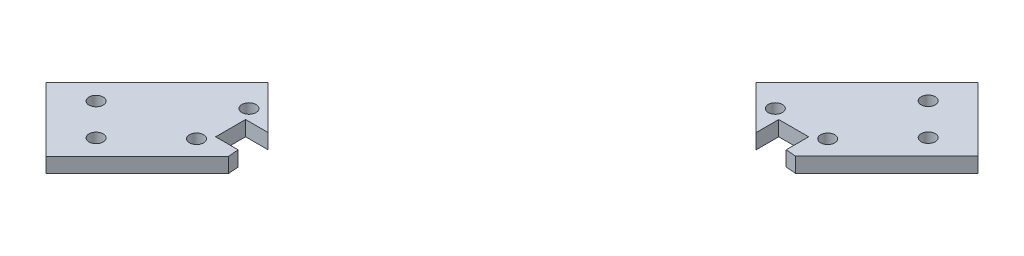
ISO-10303-21;
HEADER;
FILE_DESCRIPTION(('STEP AP214'),'2;1');
FILE_NAME('part.step','',(''),(''),'','','');
FILE_SCHEMA(('AUTOMOTIVE_DESIGN { 1 0 10303 214 1 1 1 1 }'));
ENDSEC;
DATA;
#1=APPLICATION_CONTEXT('core data for automotive mechanical design processes');
#2=APPLICATION_PROTOCOL_DEFINITION('international standard','automotive_design',2000,#1);
#3=PRODUCT_CONTEXT('',#1,'mechanical');
#4=PRODUCT('Part','Part','',(#3));
#5=PRODUCT_RELATED_PRODUCT_CATEGORY('part','',(#4));
#6=PRODUCT_DEFINITION_FORMATION('','',#4);
#7=PRODUCT_DEFINITION_CONTEXT('part definition',#1,'design');
#8=PRODUCT_DEFINITION('design','',#6,#7);
#9=PRODUCT_DEFINITION_SHAPE('','',#8);
#10=(LENGTH_UNIT() NAMED_UNIT(*) SI_UNIT(.MILLI.,.METRE.));
#11=(NAMED_UNIT(*) PLANE_ANGLE_UNIT() SI_UNIT($,.RADIAN.));
#12=(NAMED_UNIT(*) SI_UNIT($,.STERADIAN.) SOLID_ANGLE_UNIT());
#13=UNCERTAINTY_MEASURE_WITH_UNIT(LENGTH_MEASURE(1.E-05),#10,'distance_accuracy_value','');
#14=(GEOMETRIC_REPRESENTATION_CONTEXT(3) GLOBAL_UNCERTAINTY_ASSIGNED_CONTEXT((#13)) GLOBAL_UNIT_ASSIGNED_CONTEXT((#10,
#11,#12)) REPRESENTATION_CONTEXT('',''));
#15=CARTESIAN_POINT('',(0.,0.,0.));
#16=DIRECTION('',(0.,0.,1.));
#17=DIRECTION('',(1.,0.,0.));
#18=AXIS2_PLACEMENT_3D('',#15,#16,#17);
#19=CARTESIAN_POINT('',(0.,3.175,0.));
#20=DIRECTION('',(0.,1.,0.));
#21=DIRECTION('',(0.,0.,1.));
#22=AXIS2_PLACEMENT_3D('',#19,#20,#21);
#23=PLANE('',#22);
#24=CARTESIAN_POINT('',(-72.1592637490422,3.175,16.043664022809));
#25=DIRECTION('',(0.,1.,0.));
#26=DIRECTION('',(0.,0.,1.));
#27=AXIS2_PLACEMENT_3D('',#24,#25,#26);
#28=CIRCLE('',#27,1.5);
#29=CARTESIAN_POINT('',(-72.1592637490422,3.175,17.543664022809));
#30=VERTEX_POINT('',#29);
#31=EDGE_CURVE('E195',#30,#30,#28,.T.);
#32=ORIENTED_EDGE('',*,*,#31,.F.);
#33=EDGE_LOOP('',(#32));
#34=FACE_BOUND('',#33,.T.);
#35=CARTESIAN_POINT('',(-78.9286379907904,3.175,9.2807290260109));
#36=DIRECTION('',(0.,1.,0.));
#37=DIRECTION('',(0.,0.,1.));
#38=AXIS2_PLACEMENT_3D('',#35,#36,#37);
#39=CIRCLE('',#38,1.5);
#40=CARTESIAN_POINT('',(-78.9286379907904,3.175,10.7807290260109));
#41=VERTEX_POINT('',#40);
#42=EDGE_CURVE('E231',#41,#41,#39,.T.);
#43=ORIENTED_EDGE('',*,*,#42,.F.);
#44=EDGE_LOOP('',(#43));
#45=FACE_BOUND('',#44,.T.);
#46=DIRECTION('',(0.706770229864482,0.,-0.707443172401365));
#47=VECTOR('',#46,1.);
#48=CARTESIAN_POINT('',(11.12169927642,3.175,-87.6247258638486));
#49=LINE('',#48,#47);
#50=CARTESIAN_POINT('',(-87.6141018356481,3.175,11.2050853206221));
#51=VERTEX_POINT('',#50);
#52=CARTESIAN_POINT('',(-64.0867150619098,3.175,-12.3447027635743));
#53=VERTEX_POINT('',#52);
#54=EDGE_CURVE('E61',#51,#53,#49,.T.);
#55=ORIENTED_EDGE('',*,*,#54,.F.);
#56=DIRECTION('',(-0.707443172401365,0.,-0.706770229864482));
#57=VECTOR('',#56,1.);
#58=CARTESIAN_POINT('',(-49.3679005560341,3.175,49.4149055922353));
#59=LINE('',#58,#57);
#60=CARTESIAN_POINT('',(-74.0753533521517,3.175,24.7309553142183));
#61=VERTEX_POINT('',#60);
#62=EDGE_CURVE('E122',#61,#51,#59,.T.);
#63=ORIENTED_EDGE('',*,*,#62,.F.);
#64=DIRECTION('',(-0.706770229864482,0.,0.707443172401365));
#65=VECTOR('',#64,1.);
#66=CARTESIAN_POINT('',(-24.7074527961177,3.175,-24.683950278017));
#67=LINE('',#66,#65);
#68=CARTESIAN_POINT('',(-54.7368246857531,3.175,5.3740137068235));
#69=VERTEX_POINT('',#68);
#70=EDGE_CURVE('E171',#69,#61,#67,.T.);
#71=ORIENTED_EDGE('',*,*,#70,.F.);
#72=CARTESIAN_POINT('',(0.,3.175,0.));
#73=DIRECTION('',(0.,1.,0.));
#74=DIRECTION('',(0.,0.,1.));
#75=AXIS2_PLACEMENT_3D('',#72,#73,#74);
#76=CIRCLE('',#75,55.);
#77=CARTESIAN_POINT('',(-54.9082814792085,3.175,3.17500000000139));
#78=VERTEX_POINT('',#77);
#79=EDGE_CURVE('E144',#78,#69,#76,.T.);
#80=ORIENTED_EDGE('',*,*,#79,.F.);
#81=DIRECTION('',(1.,0.,0.));
#82=VECTOR('',#81,1.);
#83=CARTESIAN_POINT('',(-53.3400000000002,3.175,3.17500000000139));
#84=LINE('',#83,#82);
#85=CARTESIAN_POINT('',(-59.6900000000002,3.175,3.1750000000014));
#86=VERTEX_POINT('',#85);
#87=EDGE_CURVE('E158',#86,#78,#84,.T.);
#88=ORIENTED_EDGE('',*,*,#87,.F.);
#89=DIRECTION('',(0.,0.,1.));
#90=VECTOR('',#89,1.);
#91=CARTESIAN_POINT('',(-59.6900000000002,3.175,-3.1749999999986));
#92=LINE('',#91,#90);
#93=CARTESIAN_POINT('',(-59.6900000000002,3.175,-3.1749999999986));
#94=VERTEX_POINT('',#93);
#95=EDGE_CURVE('E156',#94,#86,#92,.T.);
#96=ORIENTED_EDGE('',*,*,#95,.F.);
#97=DIRECTION('',(-1.,0.,0.));
#98=VECTOR('',#97,1.);
#99=CARTESIAN_POINT('',(-53.3400000000002,3.175,-3.17499999999861));
#100=LINE('',#99,#98);
#101=CARTESIAN_POINT('',(-54.9082814792087,3.175,-3.17499999999861));
#102=VERTEX_POINT('',#101);
#103=EDGE_CURVE('E152',#102,#94,#100,.T.);
#104=ORIENTED_EDGE('',*,*,#103,.F.);
#105=DIRECTION('',(0.707443172401365,0.,0.706770229864482));
#106=VECTOR('',#105,1.);
#107=CARTESIAN_POINT('',(-54.9082814792087,3.175,-3.17499999999861));
#108=LINE('',#107,#106);
#109=EDGE_CURVE('E54',#53,#102,#108,.T.);
#110=ORIENTED_EDGE('',*,*,#109,.F.);
#111=EDGE_LOOP('',(#55,#63,#71,#80,#88,#96,#104,#110));
#112=FACE_BOUND('',#111,.T.);
#113=CARTESIAN_POINT('',(-61.346730494,3.175,-5.55625));
#114=DIRECTION('',(0.,1.,0.));
#115=DIRECTION('',(0.,0.,1.));
#116=AXIS2_PLACEMENT_3D('',#113,#114,#115);
#117=CIRCLE('',#116,1.5);
#118=CARTESIAN_POINT('',(-61.346730494,3.175,-4.05625));
#119=VERTEX_POINT('',#118);
#120=EDGE_CURVE('E138',#119,#119,#117,.T.);
#121=ORIENTED_EDGE('',*,*,#120,.F.);
#122=EDGE_LOOP('',(#121));
#123=FACE_BOUND('',#122,.T.);
#124=CARTESIAN_POINT('',(-61.346730494,3.175,5.55625));
#125=DIRECTION('',(0.,1.,0.));
#126=DIRECTION('',(0.,0.,1.));
#127=AXIS2_PLACEMENT_3D('',#124,#125,#126);
#128=CIRCLE('',#127,1.5);
#129=CARTESIAN_POINT('',(-61.346730494,3.175,7.05625));
#130=VERTEX_POINT('',#129);
#131=EDGE_CURVE('E141',#130,#130,#128,.T.);
#132=ORIENTED_EDGE('',*,*,#131,.F.);
#133=EDGE_LOOP('',(#132));
#134=FACE_BOUND('',#133,.T.);
#135=ADVANCED_FACE('F47',(#34,#45,#112,#123,#134),#23,.T.);
#136=CARTESIAN_POINT('',(0.,0.,0.));
#137=DIRECTION('',(0.,1.,0.));
#138=DIRECTION('',(0.,0.,1.));
#139=AXIS2_PLACEMENT_3D('',#136,#137,#138);
#140=PLANE('',#139);
#141=CARTESIAN_POINT('',(-72.1592637490422,0.,16.043664022809));
#142=DIRECTION('',(0.,1.,0.));
#143=DIRECTION('',(0.,0.,1.));
#144=AXIS2_PLACEMENT_3D('',#141,#142,#143);
#145=CIRCLE('',#144,1.5);
#146=CARTESIAN_POINT('',(-72.1592637490422,0.,17.543664022809));
#147=VERTEX_POINT('',#146);
#148=EDGE_CURVE('E192',#147,#147,#145,.T.);
#149=ORIENTED_EDGE('',*,*,#148,.T.);
#150=EDGE_LOOP('',(#149));
#151=FACE_BOUND('',#150,.T.);
#152=CARTESIAN_POINT('',(-78.9286379907904,0.,9.2807290260109));
#153=DIRECTION('',(0.,1.,0.));
#154=DIRECTION('',(0.,0.,1.));
#155=AXIS2_PLACEMENT_3D('',#152,#153,#154);
#156=CIRCLE('',#155,1.5);
#157=CARTESIAN_POINT('',(-78.9286379907904,0.,10.7807290260109));
#158=VERTEX_POINT('',#157);
#159=EDGE_CURVE('E233',#158,#158,#156,.T.);
#160=ORIENTED_EDGE('',*,*,#159,.T.);
#161=EDGE_LOOP('',(#160));
#162=FACE_BOUND('',#161,.T.);
#163=CARTESIAN_POINT('',(-61.346730494,0.,-5.55625));
#164=DIRECTION('',(0.,1.,0.));
#165=DIRECTION('',(0.,0.,1.));
#166=AXIS2_PLACEMENT_3D('',#163,#164,#165);
#167=CIRCLE('',#166,1.5);
#168=CARTESIAN_POINT('',(-61.346730494,0.,-4.05625));
#169=VERTEX_POINT('',#168);
#170=EDGE_CURVE('E123',#169,#169,#167,.T.);
#171=ORIENTED_EDGE('',*,*,#170,.T.);
#172=EDGE_LOOP('',(#171));
#173=FACE_BOUND('',#172,.T.);
#174=CARTESIAN_POINT('',(-61.346730494,0.,5.55625));
#175=DIRECTION('',(0.,1.,0.));
#176=DIRECTION('',(0.,0.,1.));
#177=AXIS2_PLACEMENT_3D('',#174,#175,#176);
#178=CIRCLE('',#177,1.5);
#179=CARTESIAN_POINT('',(-61.346730494,0.,7.05625));
#180=VERTEX_POINT('',#179);
#181=EDGE_CURVE('E136',#180,#180,#178,.T.);
#182=ORIENTED_EDGE('',*,*,#181,.T.);
#183=EDGE_LOOP('',(#182));
#184=FACE_BOUND('',#183,.T.);
#185=DIRECTION('',(-0.707443172401365,0.,-0.706770229864482));
#186=VECTOR('',#185,1.);
#187=CARTESIAN_POINT('',(-49.3679005560341,0.,49.4149055922353));
#188=LINE('',#187,#186);
#189=CARTESIAN_POINT('',(-74.0753533521517,0.,24.7309553142183));
#190=VERTEX_POINT('',#189);
#191=CARTESIAN_POINT('',(-87.6141018356481,0.,11.2050853206221));
#192=VERTEX_POINT('',#191);
#193=EDGE_CURVE('E120',#190,#192,#188,.T.);
#194=ORIENTED_EDGE('',*,*,#193,.T.);
#195=DIRECTION('',(0.706770229864482,0.,-0.707443172401365));
#196=VECTOR('',#195,1.);
#197=CARTESIAN_POINT('',(11.12169927642,0.,-87.6247258638486));
#198=LINE('',#197,#196);
#199=CARTESIAN_POINT('',(-64.0867150619098,0.,-12.3447027635743));
#200=VERTEX_POINT('',#199);
#201=EDGE_CURVE('E109',#192,#200,#198,.T.);
#202=ORIENTED_EDGE('',*,*,#201,.T.);
#203=DIRECTION('',(0.707443172401365,0.,0.706770229864482));
#204=VECTOR('',#203,1.);
#205=CARTESIAN_POINT('',(-54.9082814792087,0.,-3.17499999999861));
#206=LINE('',#205,#204);
#207=CARTESIAN_POINT('',(-54.9082814792087,0.,-3.17499999999861));
#208=VERTEX_POINT('',#207);
#209=EDGE_CURVE('E68',#200,#208,#206,.T.);
#210=ORIENTED_EDGE('',*,*,#209,.T.);
#211=DIRECTION('',(-1.,0.,0.));
#212=VECTOR('',#211,1.);
#213=CARTESIAN_POINT('',(0.,0.,-3.17499999999861));
#214=LINE('',#213,#212);
#215=CARTESIAN_POINT('',(-59.6900000000002,0.,-3.1749999999986));
#216=VERTEX_POINT('',#215);
#217=EDGE_CURVE('E170',#208,#216,#214,.T.);
#218=ORIENTED_EDGE('',*,*,#217,.T.);
#219=DIRECTION('',(0.,0.,1.));
#220=VECTOR('',#219,1.);
#221=CARTESIAN_POINT('',(-59.6900000000002,0.,-3.1749999999986));
#222=LINE('',#221,#220);
#223=CARTESIAN_POINT('',(-59.6900000000002,0.,3.1750000000014));
#224=VERTEX_POINT('',#223);
#225=EDGE_CURVE('E167',#216,#224,#222,.T.);
#226=ORIENTED_EDGE('',*,*,#225,.T.);
#227=DIRECTION('',(1.,0.,0.));
#228=VECTOR('',#227,1.);
#229=CARTESIAN_POINT('',(-59.6900000000002,0.,3.1750000000014));
#230=LINE('',#229,#228);
#231=CARTESIAN_POINT('',(-54.9082814792085,0.,3.17500000000139));
#232=VERTEX_POINT('',#231);
#233=EDGE_CURVE('E164',#224,#232,#230,.T.);
#234=ORIENTED_EDGE('',*,*,#233,.T.);
#235=CARTESIAN_POINT('',(0.,0.,0.));
#236=DIRECTION('',(0.,1.,0.));
#237=DIRECTION('',(0.,0.,1.));
#238=AXIS2_PLACEMENT_3D('',#235,#236,#237);
#239=CIRCLE('',#238,55.);
#240=CARTESIAN_POINT('',(-54.7368246857531,0.,5.3740137068235));
#241=VERTEX_POINT('',#240);
#242=EDGE_CURVE('E132',#232,#241,#239,.T.);
#243=ORIENTED_EDGE('',*,*,#242,.T.);
#244=DIRECTION('',(-0.706770229864482,0.,0.707443172401365));
#245=VECTOR('',#244,1.);
#246=CARTESIAN_POINT('',(-24.7074527961177,0.,-24.683950278017));
#247=LINE('',#246,#245);
#248=EDGE_CURVE('E128',#241,#190,#247,.T.);
#249=ORIENTED_EDGE('',*,*,#248,.T.);
#250=EDGE_LOOP('',(#194,#202,#210,#218,#226,#234,#243,#249));
#251=FACE_BOUND('',#250,.T.);
#252=ADVANCED_FACE('F126',(#151,#162,#173,#184,#251),#140,.F.);
#253=CARTESIAN_POINT('',(-49.3679005560341,3.175,49.4149055922353));
#254=DIRECTION('',(-0.706770229864482,0.,0.707443172401365));
#255=DIRECTION('',(0.707443172401365,0.,0.706770229864482));
#256=AXIS2_PLACEMENT_3D('',#253,#254,#255);
#257=PLANE('',#256);
#258=DIRECTION('',(0.,1.,0.));
#259=VECTOR('',#258,1.);
#260=CARTESIAN_POINT('',(-87.6141018356481,0.,11.2050853206221));
#261=LINE('',#260,#259);
#262=EDGE_CURVE('E112',#192,#51,#261,.T.);
#263=ORIENTED_EDGE('',*,*,#262,.F.);
#264=ORIENTED_EDGE('',*,*,#193,.F.);
#265=DIRECTION('',(0.,1.,0.));
#266=VECTOR('',#265,1.);
#267=CARTESIAN_POINT('',(-74.0753533521517,-6.825,24.7309553142183));
#268=LINE('',#267,#266);
#269=EDGE_CURVE('E129',#190,#61,#268,.T.);
#270=ORIENTED_EDGE('',*,*,#269,.T.);
#271=ORIENTED_EDGE('',*,*,#62,.T.);
#272=EDGE_LOOP('',(#263,#264,#270,#271));
#273=FACE_BOUND('',#272,.T.);
#274=ADVANCED_FACE('F118',(#273),#257,.T.);
#275=CARTESIAN_POINT('',(-61.346730494,3.175,-5.55625));
#276=DIRECTION('',(0.,-1.,0.));
#277=DIRECTION('',(0.,0.,-1.));
#278=AXIS2_PLACEMENT_3D('',#275,#276,#277);
#279=CYLINDRICAL_SURFACE('',#278,1.5);
#280=ORIENTED_EDGE('',*,*,#120,.T.);
#281=EDGE_LOOP('',(#280));
#282=FACE_BOUND('',#281,.T.);
#283=ORIENTED_EDGE('',*,*,#170,.F.);
#284=EDGE_LOOP('',(#283));
#285=FACE_BOUND('',#284,.T.);
#286=ADVANCED_FACE('F208',(#282,#285),#279,.F.);
#287=CARTESIAN_POINT('',(-61.346730494,3.175,5.55625));
#288=DIRECTION('',(0.,-1.,0.));
#289=DIRECTION('',(0.,0.,-1.));
#290=AXIS2_PLACEMENT_3D('',#287,#288,#289);
#291=CYLINDRICAL_SURFACE('',#290,1.5);
#292=ORIENTED_EDGE('',*,*,#131,.T.);
#293=EDGE_LOOP('',(#292));
#294=FACE_BOUND('',#293,.T.);
#295=ORIENTED_EDGE('',*,*,#181,.F.);
#296=EDGE_LOOP('',(#295));
#297=FACE_BOUND('',#296,.T.);
#298=ADVANCED_FACE('F206',(#294,#297),#291,.F.);
#299=CARTESIAN_POINT('',(0.,3.175,0.));
#300=DIRECTION('',(0.,-1.,0.));
#301=DIRECTION('',(0.,0.,-1.));
#302=AXIS2_PLACEMENT_3D('',#299,#300,#301);
#303=CYLINDRICAL_SURFACE('',#302,55.);
#304=DIRECTION('',(0.,1.,0.));
#305=VECTOR('',#304,1.);
#306=CARTESIAN_POINT('',(-54.7368246857531,-6.825,5.3740137068235));
#307=LINE('',#306,#305);
#308=EDGE_CURVE('E163',#241,#69,#307,.T.);
#309=ORIENTED_EDGE('',*,*,#308,.F.);
#310=ORIENTED_EDGE('',*,*,#242,.F.);
#311=DIRECTION('',(0.,-1.,0.));
#312=VECTOR('',#311,1.);
#313=CARTESIAN_POINT('',(-54.9082814792085,3.175,3.17500000000139));
#314=LINE('',#313,#312);
#315=EDGE_CURVE('E146',#78,#232,#314,.T.);
#316=ORIENTED_EDGE('',*,*,#315,.F.);
#317=ORIENTED_EDGE('',*,*,#79,.T.);
#318=EDGE_LOOP('',(#309,#310,#316,#317));
#319=FACE_BOUND('',#318,.T.);
#320=ADVANCED_FACE('F182',(#319),#303,.F.);
#321=CARTESIAN_POINT('',(-53.3400000000002,0.,3.17500000000139));
#322=DIRECTION('',(0.,0.,1.));
#323=DIRECTION('',(1.,0.,0.));
#324=AXIS2_PLACEMENT_3D('',#321,#322,#323);
#325=PLANE('',#324);
#326=ORIENTED_EDGE('',*,*,#315,.T.);
#327=ORIENTED_EDGE('',*,*,#233,.F.);
#328=DIRECTION('',(0.,1.,0.));
#329=VECTOR('',#328,1.);
#330=CARTESIAN_POINT('',(-59.6900000000002,0.,3.1750000000014));
#331=LINE('',#330,#329);
#332=EDGE_CURVE('E148',#224,#86,#331,.T.);
#333=ORIENTED_EDGE('',*,*,#332,.T.);
#334=ORIENTED_EDGE('',*,*,#87,.T.);
#335=EDGE_LOOP('',(#326,#327,#333,#334));
#336=FACE_BOUND('',#335,.T.);
#337=ADVANCED_FACE('F215',(#336),#325,.F.);
#338=CARTESIAN_POINT('',(-59.6900000000002,0.,-3.1749999999986));
#339=DIRECTION('',(-1.,0.,0.));
#340=DIRECTION('',(0.,0.,1.));
#341=AXIS2_PLACEMENT_3D('',#338,#339,#340);
#342=PLANE('',#341);
#343=ORIENTED_EDGE('',*,*,#95,.T.);
#344=ORIENTED_EDGE('',*,*,#332,.F.);
#345=ORIENTED_EDGE('',*,*,#225,.F.);
#346=DIRECTION('',(0.,1.,0.));
#347=VECTOR('',#346,1.);
#348=CARTESIAN_POINT('',(-59.6900000000002,0.,-3.1749999999986));
#349=LINE('',#348,#347);
#350=EDGE_CURVE('E153',#216,#94,#349,.T.);
#351=ORIENTED_EDGE('',*,*,#350,.T.);
#352=EDGE_LOOP('',(#343,#344,#345,#351));
#353=FACE_BOUND('',#352,.T.);
#354=ADVANCED_FACE('F282',(#353),#342,.F.);
#355=CARTESIAN_POINT('',(-53.3400000000002,0.,-3.17499999999861));
#356=DIRECTION('',(0.,0.,-1.));
#357=DIRECTION('',(-1.,0.,0.));
#358=AXIS2_PLACEMENT_3D('',#355,#356,#357);
#359=PLANE('',#358);
#360=DIRECTION('',(0.,-1.,0.));
#361=VECTOR('',#360,1.);
#362=CARTESIAN_POINT('',(-54.9082814792087,3.175,-3.17499999999861));
#363=LINE('',#362,#361);
#364=EDGE_CURVE('E149',#208,#102,#363,.F.);
#365=ORIENTED_EDGE('',*,*,#364,.T.);
#366=ORIENTED_EDGE('',*,*,#103,.T.);
#367=ORIENTED_EDGE('',*,*,#350,.F.);
#368=ORIENTED_EDGE('',*,*,#217,.F.);
#369=EDGE_LOOP('',(#365,#366,#367,#368));
#370=FACE_BOUND('',#369,.T.);
#371=ADVANCED_FACE('F293',(#370),#359,.F.);
#372=CARTESIAN_POINT('',(-24.7074527961177,-6.825,-24.683950278017));
#373=DIRECTION('',(-0.707443172401365,0.,-0.706770229864482));
#374=DIRECTION('',(-0.706770229864482,0.,0.707443172401365));
#375=AXIS2_PLACEMENT_3D('',#372,#373,#374);
#376=PLANE('',#375);
#377=ORIENTED_EDGE('',*,*,#308,.T.);
#378=ORIENTED_EDGE('',*,*,#70,.T.);
#379=ORIENTED_EDGE('',*,*,#269,.F.);
#380=ORIENTED_EDGE('',*,*,#248,.F.);
#381=EDGE_LOOP('',(#377,#378,#379,#380));
#382=FACE_BOUND('',#381,.T.);
#383=ADVANCED_FACE('F186',(#382),#376,.F.);
#384=CARTESIAN_POINT('',(-54.9082814792087,0.,-3.17499999999861));
#385=DIRECTION('',(-0.706770229864482,0.,0.707443172401365));
#386=DIRECTION('',(0.707443172401365,0.,0.706770229864482));
#387=AXIS2_PLACEMENT_3D('',#384,#385,#386);
#388=PLANE('',#387);
#389=ORIENTED_EDGE('',*,*,#209,.F.);
#390=DIRECTION('',(0.,1.,0.));
#391=VECTOR('',#390,1.);
#392=CARTESIAN_POINT('',(-64.0867150619098,0.,-12.3447027635743));
#393=LINE('',#392,#391);
#394=EDGE_CURVE('E12',#200,#53,#393,.T.);
#395=ORIENTED_EDGE('',*,*,#394,.T.);
#396=ORIENTED_EDGE('',*,*,#109,.T.);
#397=ORIENTED_EDGE('',*,*,#364,.F.);
#398=EDGE_LOOP('',(#389,#395,#396,#397));
#399=FACE_BOUND('',#398,.T.);
#400=ADVANCED_FACE('F251',(#399),#388,.F.);
#401=CARTESIAN_POINT('',(11.12169927642,0.,-87.6247258638486));
#402=DIRECTION('',(0.707443172401365,0.,0.706770229864482));
#403=DIRECTION('',(0.706770229864482,0.,-0.707443172401365));
#404=AXIS2_PLACEMENT_3D('',#401,#402,#403);
#405=PLANE('',#404);
#406=ORIENTED_EDGE('',*,*,#201,.F.);
#407=ORIENTED_EDGE('',*,*,#262,.T.);
#408=ORIENTED_EDGE('',*,*,#54,.T.);
#409=ORIENTED_EDGE('',*,*,#394,.F.);
#410=EDGE_LOOP('',(#406,#407,#408,#409));
#411=FACE_BOUND('',#410,.T.);
#412=ADVANCED_FACE('F111',(#411),#405,.F.);
#413=CARTESIAN_POINT('',(-78.9286379907904,0.,9.2807290260109));
#414=DIRECTION('',(0.,1.,0.));
#415=DIRECTION('',(0.,0.,1.));
#416=AXIS2_PLACEMENT_3D('',#413,#414,#415);
#417=CYLINDRICAL_SURFACE('',#416,1.5);
#418=ORIENTED_EDGE('',*,*,#159,.F.);
#419=EDGE_LOOP('',(#418));
#420=FACE_BOUND('',#419,.T.);
#421=ORIENTED_EDGE('',*,*,#42,.T.);
#422=EDGE_LOOP('',(#421));
#423=FACE_BOUND('',#422,.T.);
#424=ADVANCED_FACE('F240',(#420,#423),#417,.F.);
#425=CARTESIAN_POINT('',(-72.1592637490422,0.,16.043664022809));
#426=DIRECTION('',(0.,1.,0.));
#427=DIRECTION('',(0.,0.,1.));
#428=AXIS2_PLACEMENT_3D('',#425,#426,#427);
#429=CYLINDRICAL_SURFACE('',#428,1.5);
#430=ORIENTED_EDGE('',*,*,#148,.F.);
#431=EDGE_LOOP('',(#430));
#432=FACE_BOUND('',#431,.T.);
#433=ORIENTED_EDGE('',*,*,#31,.T.);
#434=EDGE_LOOP('',(#433));
#435=FACE_BOUND('',#434,.T.);
#436=ADVANCED_FACE('F238',(#432,#435),#429,.F.);
#437=CLOSED_SHELL('',(#135,#252,#274,#286,#298,#320,#337,#354,#371,#383,#400,#412,#424,#436));
#438=MANIFOLD_SOLID_BREP('B2',#437);
#439=CARTESIAN_POINT('',(5.55625,3.175,-61.346730494));
#440=DIRECTION('',(0.,-1.,0.));
#441=DIRECTION('',(0.,0.,-1.));
#442=AXIS2_PLACEMENT_3D('',#439,#440,#441);
#443=CYLINDRICAL_SURFACE('',#442,1.5);
#444=CARTESIAN_POINT('',(5.55625,3.175,-61.346730494));
#445=DIRECTION('',(0.,1.,0.));
#446=DIRECTION('',(0.,0.,1.));
#447=AXIS2_PLACEMENT_3D('',#444,#445,#446);
#448=CIRCLE('',#447,1.5);
#449=CARTESIAN_POINT('',(5.55625,3.175,-59.846730494));
#450=VERTEX_POINT('',#449);
#451=EDGE_CURVE('E504',#450,#450,#448,.T.);
#452=ORIENTED_EDGE('',*,*,#451,.T.);
#453=EDGE_LOOP('',(#452));
#454=FACE_BOUND('',#453,.T.);
#455=CARTESIAN_POINT('',(5.55625,0.,-61.346730494));
#456=DIRECTION('',(0.,1.,0.));
#457=DIRECTION('',(0.,0.,1.));
#458=AXIS2_PLACEMENT_3D('',#455,#456,#457);
#459=CIRCLE('',#458,1.5);
#460=CARTESIAN_POINT('',(5.55625,0.,-59.846730494));
#461=VERTEX_POINT('',#460);
#462=EDGE_CURVE('E470',#461,#461,#459,.T.);
#463=ORIENTED_EDGE('',*,*,#462,.F.);
#464=EDGE_LOOP('',(#463));
#465=FACE_BOUND('',#464,.T.);
#466=ADVANCED_FACE('F383',(#454,#465),#443,.F.);
#467=CARTESIAN_POINT('',(-5.55625,3.175,-61.346730494));
#468=DIRECTION('',(0.,-1.,0.));
#469=DIRECTION('',(0.,0.,-1.));
#470=AXIS2_PLACEMENT_3D('',#467,#468,#469);
#471=CYLINDRICAL_SURFACE('',#470,1.5);
#472=CARTESIAN_POINT('',(-5.55625,3.175,-61.346730494));
#473=DIRECTION('',(0.,1.,0.));
#474=DIRECTION('',(0.,0.,1.));
#475=AXIS2_PLACEMENT_3D('',#472,#473,#474);
#476=CIRCLE('',#475,1.5);
#477=CARTESIAN_POINT('',(-5.55625,3.175,-59.846730494));
#478=VERTEX_POINT('',#477);
#479=EDGE_CURVE('E502',#478,#478,#476,.T.);
#480=ORIENTED_EDGE('',*,*,#479,.T.);
#481=EDGE_LOOP('',(#480));
#482=FACE_BOUND('',#481,.T.);
#483=CARTESIAN_POINT('',(-5.55625,0.,-61.346730494));
#484=DIRECTION('',(0.,1.,0.));
#485=DIRECTION('',(0.,0.,1.));
#486=AXIS2_PLACEMENT_3D('',#483,#484,#485);
#487=CIRCLE('',#486,1.5);
#488=CARTESIAN_POINT('',(-5.55625,0.,-59.846730494));
#489=VERTEX_POINT('',#488);
#490=EDGE_CURVE('E466',#489,#489,#487,.T.);
#491=ORIENTED_EDGE('',*,*,#490,.F.);
#492=EDGE_LOOP('',(#491));
#493=FACE_BOUND('',#492,.T.);
#494=ADVANCED_FACE('F528',(#482,#493),#471,.F.);
#495=CARTESIAN_POINT('',(3.175,0.,-53.34));
#496=DIRECTION('',(1.,0.,0.));
#497=DIRECTION('',(0.,0.,-1.));
#498=AXIS2_PLACEMENT_3D('',#495,#496,#497);
#499=PLANE('',#498);
#500=DIRECTION('',(0.,-1.,0.));
#501=VECTOR('',#500,1.);
#502=CARTESIAN_POINT('',(3.175,3.175,-54.9082814792086));
#503=LINE('',#502,#501);
#504=CARTESIAN_POINT('',(3.175,0.,-54.9082814792086));
#505=VERTEX_POINT('',#504);
#506=CARTESIAN_POINT('',(3.175,3.175,-54.9082814792086));
#507=VERTEX_POINT('',#506);
#508=EDGE_CURVE('E473',#505,#507,#503,.F.);
#509=ORIENTED_EDGE('',*,*,#508,.T.);
#510=DIRECTION('',(0.,0.,-1.));
#511=VECTOR('',#510,1.);
#512=CARTESIAN_POINT('',(3.175,3.175,-53.34));
#513=LINE('',#512,#511);
#514=CARTESIAN_POINT('',(3.175,3.175,-59.69));
#515=VERTEX_POINT('',#514);
#516=EDGE_CURVE('E586',#507,#515,#513,.T.);
#517=ORIENTED_EDGE('',*,*,#516,.T.);
#518=DIRECTION('',(0.,1.,0.));
#519=VECTOR('',#518,1.);
#520=CARTESIAN_POINT('',(3.175,0.,-59.69));
#521=LINE('',#520,#519);
#522=CARTESIAN_POINT('',(3.175,0.,-59.69));
#523=VERTEX_POINT('',#522);
#524=EDGE_CURVE('E497',#523,#515,#521,.T.);
#525=ORIENTED_EDGE('',*,*,#524,.F.);
#526=DIRECTION('',(0.,0.,-1.));
#527=VECTOR('',#526,1.);
#528=CARTESIAN_POINT('',(3.175,0.,0.));
#529=LINE('',#528,#527);
#530=EDGE_CURVE('E484',#505,#523,#529,.T.);
#531=ORIENTED_EDGE('',*,*,#530,.F.);
#532=EDGE_LOOP('',(#509,#517,#525,#531));
#533=FACE_BOUND('',#532,.T.);
#534=ADVANCED_FACE('F533',(#533),#499,.F.);
#535=CARTESIAN_POINT('',(0.,3.175,0.));
#536=DIRECTION('',(0.,-1.,0.));
#537=DIRECTION('',(0.,0.,-1.));
#538=AXIS2_PLACEMENT_3D('',#535,#536,#537);
#539=CYLINDRICAL_SURFACE('',#538,55.);
#540=DIRECTION('',(0.,1.,0.));
#541=VECTOR('',#540,1.);
#542=CARTESIAN_POINT('',(5.32191909351782,-6.825,-54.7419142628576));
#543=LINE('',#542,#541);
#544=CARTESIAN_POINT('',(5.32191909351782,0.,-54.7419142628576));
#545=VERTEX_POINT('',#544);
#546=CARTESIAN_POINT('',(5.32191909351782,3.175,-54.7419142628576));
#547=VERTEX_POINT('',#546);
#548=EDGE_CURVE('E405',#545,#547,#543,.T.);
#549=ORIENTED_EDGE('',*,*,#548,.T.);
#550=CARTESIAN_POINT('',(0.,3.175,0.));
#551=DIRECTION('',(0.,1.,0.));
#552=DIRECTION('',(0.,0.,1.));
#553=AXIS2_PLACEMENT_3D('',#550,#551,#552);
#554=CIRCLE('',#553,55.);
#555=EDGE_CURVE('E476',#547,#507,#554,.T.);
#556=ORIENTED_EDGE('',*,*,#555,.T.);
#557=ORIENTED_EDGE('',*,*,#508,.F.);
#558=CARTESIAN_POINT('',(0.,0.,0.));
#559=DIRECTION('',(0.,1.,0.));
#560=DIRECTION('',(0.,0.,1.));
#561=AXIS2_PLACEMENT_3D('',#558,#559,#560);
#562=CIRCLE('',#561,55.);
#563=EDGE_CURVE('E481',#545,#505,#562,.T.);
#564=ORIENTED_EDGE('',*,*,#563,.F.);
#565=EDGE_LOOP('',(#549,#556,#557,#564));
#566=FACE_BOUND('',#565,.T.);
#567=ADVANCED_FACE('F490',(#566),#539,.F.);
#568=CARTESIAN_POINT('',(-24.7074527961177,-6.825,-24.683950278017));
#569=DIRECTION('',(-0.707443172401365,0.,-0.706770229864482));
#570=DIRECTION('',(-0.706770229864482,0.,0.707443172401365));
#571=AXIS2_PLACEMENT_3D('',#568,#569,#570);
#572=PLANE('',#571);
#573=DIRECTION('',(0.,1.,0.));
#574=VECTOR('',#573,1.);
#575=CARTESIAN_POINT('',(24.6604477599164,-6.825,-74.0988558702524));
#576=LINE('',#575,#574);
#577=CARTESIAN_POINT('',(24.6604477599164,0.,-74.0988558702524));
#578=VERTEX_POINT('',#577);
#579=CARTESIAN_POINT('',(24.6604477599164,3.175,-74.0988558702524));
#580=VERTEX_POINT('',#579);
#581=EDGE_CURVE('E465',#578,#580,#576,.T.);
#582=ORIENTED_EDGE('',*,*,#581,.T.);
#583=DIRECTION('',(-0.706770229864482,0.,0.707443172401365));
#584=VECTOR('',#583,1.);
#585=CARTESIAN_POINT('',(-24.7074527961177,3.175,-24.683950278017));
#586=LINE('',#585,#584);
#587=EDGE_CURVE('E581',#580,#547,#586,.T.);
#588=ORIENTED_EDGE('',*,*,#587,.T.);
#589=ORIENTED_EDGE('',*,*,#548,.F.);
#590=DIRECTION('',(-0.706770229864482,0.,0.707443172401365));
#591=VECTOR('',#590,1.);
#592=CARTESIAN_POINT('',(-24.7074527961177,0.,-24.683950278017));
#593=LINE('',#592,#591);
#594=EDGE_CURVE('E391',#578,#545,#593,.T.);
#595=ORIENTED_EDGE('',*,*,#594,.F.);
#596=EDGE_LOOP('',(#582,#588,#589,#595));
#597=FACE_BOUND('',#596,.T.);
#598=ADVANCED_FACE('F537',(#597),#572,.F.);
#599=CARTESIAN_POINT('',(49.3679005560341,3.175,-49.4149055922353));
#600=DIRECTION('',(-0.706770229864482,0.,0.707443172401365));
#601=DIRECTION('',(0.707443172401365,0.,0.706770229864482));
#602=AXIS2_PLACEMENT_3D('',#599,#600,#601);
#603=PLANE('',#602);
#604=DIRECTION('',(-0.707443172401365,0.,-0.706770229864482));
#605=VECTOR('',#604,1.);
#606=CARTESIAN_POINT('',(49.3679005560341,0.,-49.4149055922353));
#607=LINE('',#606,#605);
#608=CARTESIAN_POINT('',(11.12169927642,0.,-87.6247258638486));
#609=VERTEX_POINT('',#608);
#610=EDGE_CURVE('E460',#578,#609,#607,.T.);
#611=ORIENTED_EDGE('',*,*,#610,.T.);
#612=DIRECTION('',(0.,1.,0.));
#613=VECTOR('',#612,1.);
#614=CARTESIAN_POINT('',(11.12169927642,0.,-87.6247258638486));
#615=LINE('',#614,#613);
#616=CARTESIAN_POINT('',(11.12169927642,3.175,-87.6247258638486));
#617=VERTEX_POINT('',#616);
#618=EDGE_CURVE('E445',#609,#617,#615,.T.);
#619=ORIENTED_EDGE('',*,*,#618,.T.);
#620=DIRECTION('',(-0.707443172401365,0.,-0.706770229864482));
#621=VECTOR('',#620,1.);
#622=CARTESIAN_POINT('',(49.3679005560341,3.175,-49.4149055922353));
#623=LINE('',#622,#621);
#624=EDGE_CURVE('E483',#580,#617,#623,.T.);
#625=ORIENTED_EDGE('',*,*,#624,.F.);
#626=ORIENTED_EDGE('',*,*,#581,.F.);
#627=EDGE_LOOP('',(#611,#619,#625,#626));
#628=FACE_BOUND('',#627,.T.);
#629=ADVANCED_FACE('F385',(#628),#603,.F.);
#630=CARTESIAN_POINT('',(3.175,0.,-59.69));
#631=DIRECTION('',(0.,0.,-1.));
#632=DIRECTION('',(-1.,0.,0.));
#633=AXIS2_PLACEMENT_3D('',#630,#631,#632);
#634=PLANE('',#633);
#635=DIRECTION('',(-1.,0.,0.));
#636=VECTOR('',#635,1.);
#637=CARTESIAN_POINT('',(3.175,3.175,-59.69));
#638=LINE('',#637,#636);
#639=CARTESIAN_POINT('',(-3.175,3.175,-59.69));
#640=VERTEX_POINT('',#639);
#641=EDGE_CURVE('E595',#515,#640,#638,.T.);
#642=ORIENTED_EDGE('',*,*,#641,.T.);
#643=DIRECTION('',(0.,1.,0.));
#644=VECTOR('',#643,1.);
#645=CARTESIAN_POINT('',(-3.175,0.,-59.69));
#646=LINE('',#645,#644);
#647=CARTESIAN_POINT('',(-3.175,0.,-59.69));
#648=VERTEX_POINT('',#647);
#649=EDGE_CURVE('E495',#648,#640,#646,.T.);
#650=ORIENTED_EDGE('',*,*,#649,.F.);
#651=DIRECTION('',(-1.,0.,0.));
#652=VECTOR('',#651,1.);
#653=CARTESIAN_POINT('',(3.175,0.,-59.69));
#654=LINE('',#653,#652);
#655=EDGE_CURVE('E588',#523,#648,#654,.T.);
#656=ORIENTED_EDGE('',*,*,#655,.F.);
#657=ORIENTED_EDGE('',*,*,#524,.T.);
#658=EDGE_LOOP('',(#642,#650,#656,#657));
#659=FACE_BOUND('',#658,.T.);
#660=ADVANCED_FACE('F546',(#659),#634,.F.);
#661=CARTESIAN_POINT('',(-3.175,0.,-53.34));
#662=DIRECTION('',(-1.,0.,0.));
#663=DIRECTION('',(0.,0.,1.));
#664=AXIS2_PLACEMENT_3D('',#661,#662,#663);
#665=PLANE('',#664);
#666=DIRECTION('',(0.,-1.,0.));
#667=VECTOR('',#666,1.);
#668=CARTESIAN_POINT('',(-3.175,3.175,-54.9082814792086));
#669=LINE('',#668,#667);
#670=CARTESIAN_POINT('',(-3.175,3.175,-54.9082814792086));
#671=VERTEX_POINT('',#670);
#672=CARTESIAN_POINT('',(-3.175,0.,-54.9082814792086));
#673=VERTEX_POINT('',#672);
#674=EDGE_CURVE('E467',#671,#673,#669,.T.);
#675=ORIENTED_EDGE('',*,*,#674,.T.);
#676=DIRECTION('',(0.,0.,1.));
#677=VECTOR('',#676,1.);
#678=CARTESIAN_POINT('',(-3.175,0.,-59.69));
#679=LINE('',#678,#677);
#680=EDGE_CURVE('E591',#648,#673,#679,.T.);
#681=ORIENTED_EDGE('',*,*,#680,.F.);
#682=ORIENTED_EDGE('',*,*,#649,.T.);
#683=DIRECTION('',(0.,0.,1.));
#684=VECTOR('',#683,1.);
#685=CARTESIAN_POINT('',(-3.175,3.175,-53.34));
#686=LINE('',#685,#684);
#687=EDGE_CURVE('E592',#640,#671,#686,.T.);
#688=ORIENTED_EDGE('',*,*,#687,.T.);
#689=EDGE_LOOP('',(#675,#681,#682,#688));
#690=FACE_BOUND('',#689,.T.);
#691=ADVANCED_FACE('F521',(#690),#665,.F.);
#692=CARTESIAN_POINT('',(0.,0.,0.));
#693=DIRECTION('',(0.,1.,0.));
#694=DIRECTION('',(0.,0.,1.));
#695=AXIS2_PLACEMENT_3D('',#692,#693,#694);
#696=PLANE('',#695);
#697=CARTESIAN_POINT('',(16.002609238627,0.,-72.2021512023198));
#698=DIRECTION('',(0.,1.,0.));
#699=DIRECTION('',(0.,0.,1.));
#700=AXIS2_PLACEMENT_3D('',#697,#698,#699);
#701=CIRCLE('',#700,1.49999999999999);
#702=CARTESIAN_POINT('',(16.002609238627,0.,-70.7021512023198));
#703=VERTEX_POINT('',#702);
#704=EDGE_CURVE('E567',#703,#703,#701,.F.);
#705=ORIENTED_EDGE('',*,*,#704,.F.);
#706=EDGE_LOOP('',(#705));
#707=FACE_BOUND('',#706,.T.);
#708=CARTESIAN_POINT('',(9.23323499687884,0.,-78.9650861991179));
#709=DIRECTION('',(0.,1.,0.));
#710=DIRECTION('',(0.,0.,1.));
#711=AXIS2_PLACEMENT_3D('',#708,#709,#710);
#712=CIRCLE('',#711,1.5);
#713=CARTESIAN_POINT('',(9.23323499687884,0.,-77.4650861991179));
#714=VERTEX_POINT('',#713);
#715=EDGE_CURVE('E570',#714,#714,#712,.F.);
#716=ORIENTED_EDGE('',*,*,#715,.F.);
#717=EDGE_LOOP('',(#716));
#718=FACE_BOUND('',#717,.T.);
#719=DIRECTION('',(-0.707443172401365,0.,-0.706770229864482));
#720=VECTOR('',#719,1.);
#721=CARTESIAN_POINT('',(-3.175,0.,-54.9082814792086));
#722=LINE('',#721,#720);
#723=CARTESIAN_POINT('',(-12.37806217375,0.,-64.1025894063308));
#724=VERTEX_POINT('',#723);
#725=EDGE_CURVE('E462',#673,#724,#722,.T.);
#726=ORIENTED_EDGE('',*,*,#725,.T.);
#727=DIRECTION('',(0.706770229864482,0.,-0.707443172401365));
#728=VECTOR('',#727,1.);
#729=CARTESIAN_POINT('',(11.12169927642,0.,-87.6247258638486));
#730=LINE('',#729,#728);
#731=EDGE_CURVE('E398',#724,#609,#730,.T.);
#732=ORIENTED_EDGE('',*,*,#731,.T.);
#733=ORIENTED_EDGE('',*,*,#610,.F.);
#734=ORIENTED_EDGE('',*,*,#594,.T.);
#735=ORIENTED_EDGE('',*,*,#563,.T.);
#736=ORIENTED_EDGE('',*,*,#530,.T.);
#737=ORIENTED_EDGE('',*,*,#655,.T.);
#738=ORIENTED_EDGE('',*,*,#680,.T.);
#739=EDGE_LOOP('',(#726,#732,#733,#734,#735,#736,#737,#738));
#740=FACE_BOUND('',#739,.T.);
#741=ORIENTED_EDGE('',*,*,#490,.T.);
#742=EDGE_LOOP('',(#741));
#743=FACE_BOUND('',#742,.T.);
#744=ORIENTED_EDGE('',*,*,#462,.T.);
#745=EDGE_LOOP('',(#744));
#746=FACE_BOUND('',#745,.T.);
#747=ADVANCED_FACE('F458',(#707,#718,#740,#743,#746),#696,.F.);
#748=CARTESIAN_POINT('',(0.,3.175,0.));
#749=DIRECTION('',(0.,1.,0.));
#750=DIRECTION('',(0.,0.,1.));
#751=AXIS2_PLACEMENT_3D('',#748,#749,#750);
#752=PLANE('',#751);
#753=CARTESIAN_POINT('',(16.002609238627,3.175,-72.2021512023198));
#754=DIRECTION('',(0.,1.,0.));
#755=DIRECTION('',(0.,0.,1.));
#756=AXIS2_PLACEMENT_3D('',#753,#754,#755);
#757=CIRCLE('',#756,1.49999999999999);
#758=CARTESIAN_POINT('',(16.002609238627,3.175,-70.7021512023198));
#759=VERTEX_POINT('',#758);
#760=EDGE_CURVE('E569',#759,#759,#757,.F.);
#761=ORIENTED_EDGE('',*,*,#760,.T.);
#762=EDGE_LOOP('',(#761));
#763=FACE_BOUND('',#762,.T.);
#764=CARTESIAN_POINT('',(9.23323499687884,3.175,-78.9650861991179));
#765=DIRECTION('',(0.,1.,0.));
#766=DIRECTION('',(0.,0.,1.));
#767=AXIS2_PLACEMENT_3D('',#764,#765,#766);
#768=CIRCLE('',#767,1.5);
#769=CARTESIAN_POINT('',(9.23323499687884,3.175,-77.4650861991179));
#770=VERTEX_POINT('',#769);
#771=EDGE_CURVE('E574',#770,#770,#768,.F.);
#772=ORIENTED_EDGE('',*,*,#771,.T.);
#773=EDGE_LOOP('',(#772));
#774=FACE_BOUND('',#773,.T.);
#775=DIRECTION('',(0.706770229864482,0.,-0.707443172401365));
#776=VECTOR('',#775,1.);
#777=CARTESIAN_POINT('',(11.12169927642,3.175,-87.6247258638486));
#778=LINE('',#777,#776);
#779=CARTESIAN_POINT('',(-12.37806217375,3.175,-64.1025894063308));
#780=VERTEX_POINT('',#779);
#781=EDGE_CURVE('E448',#780,#617,#778,.T.);
#782=ORIENTED_EDGE('',*,*,#781,.F.);
#783=DIRECTION('',(-0.707443172401365,0.,-0.706770229864482));
#784=VECTOR('',#783,1.);
#785=CARTESIAN_POINT('',(-3.175,3.175,-54.9082814792086));
#786=LINE('',#785,#784);
#787=EDGE_CURVE('E453',#671,#780,#786,.T.);
#788=ORIENTED_EDGE('',*,*,#787,.F.);
#789=ORIENTED_EDGE('',*,*,#687,.F.);
#790=ORIENTED_EDGE('',*,*,#641,.F.);
#791=ORIENTED_EDGE('',*,*,#516,.F.);
#792=ORIENTED_EDGE('',*,*,#555,.F.);
#793=ORIENTED_EDGE('',*,*,#587,.F.);
#794=ORIENTED_EDGE('',*,*,#624,.T.);
#795=EDGE_LOOP('',(#782,#788,#789,#790,#791,#792,#793,#794));
#796=FACE_BOUND('',#795,.T.);
#797=ORIENTED_EDGE('',*,*,#479,.F.);
#798=EDGE_LOOP('',(#797));
#799=FACE_BOUND('',#798,.T.);
#800=ORIENTED_EDGE('',*,*,#451,.F.);
#801=EDGE_LOOP('',(#800));
#802=FACE_BOUND('',#801,.T.);
#803=ADVANCED_FACE('F510',(#763,#774,#796,#799,#802),#752,.T.);
#804=CARTESIAN_POINT('',(-3.175,0.,-54.9082814792086));
#805=DIRECTION('',(0.706770229864482,0.,-0.707443172401365));
#806=DIRECTION('',(-0.707443172401365,0.,-0.706770229864482));
#807=AXIS2_PLACEMENT_3D('',#804,#805,#806);
#808=PLANE('',#807);
#809=ORIENTED_EDGE('',*,*,#787,.T.);
#810=DIRECTION('',(0.,-1.,0.));
#811=VECTOR('',#810,1.);
#812=CARTESIAN_POINT('',(-12.37806217375,0.,-64.1025894063308));
#813=LINE('',#812,#811);
#814=EDGE_CURVE('E45',#780,#724,#813,.T.);
#815=ORIENTED_EDGE('',*,*,#814,.T.);
#816=ORIENTED_EDGE('',*,*,#725,.F.);
#817=ORIENTED_EDGE('',*,*,#674,.F.);
#818=EDGE_LOOP('',(#809,#815,#816,#817));
#819=FACE_BOUND('',#818,.T.);
#820=ADVANCED_FACE('F512',(#819),#808,.F.);
#821=CARTESIAN_POINT('',(11.12169927642,0.,-87.6247258638486));
#822=DIRECTION('',(0.707443172401365,0.,0.706770229864482));
#823=DIRECTION('',(0.706770229864482,0.,-0.707443172401365));
#824=AXIS2_PLACEMENT_3D('',#821,#822,#823);
#825=PLANE('',#824);
#826=ORIENTED_EDGE('',*,*,#781,.T.);
#827=ORIENTED_EDGE('',*,*,#618,.F.);
#828=ORIENTED_EDGE('',*,*,#731,.F.);
#829=ORIENTED_EDGE('',*,*,#814,.F.);
#830=EDGE_LOOP('',(#826,#827,#828,#829));
#831=FACE_BOUND('',#830,.T.);
#832=ADVANCED_FACE('F446',(#831),#825,.F.);
#833=CARTESIAN_POINT('',(9.23323499687884,0.,-78.9650861991179));
#834=DIRECTION('',(0.,1.,0.));
#835=DIRECTION('',(0.,0.,1.));
#836=AXIS2_PLACEMENT_3D('',#833,#834,#835);
#837=CYLINDRICAL_SURFACE('',#836,1.5);
#838=ORIENTED_EDGE('',*,*,#715,.T.);
#839=EDGE_LOOP('',(#838));
#840=FACE_BOUND('',#839,.T.);
#841=ORIENTED_EDGE('',*,*,#771,.F.);
#842=EDGE_LOOP('',(#841));
#843=FACE_BOUND('',#842,.T.);
#844=ADVANCED_FACE('F555',(#840,#843),#837,.F.);
#845=CARTESIAN_POINT('',(16.002609238627,0.,-72.2021512023198));
#846=DIRECTION('',(0.,1.,0.));
#847=DIRECTION('',(0.,0.,1.));
#848=AXIS2_PLACEMENT_3D('',#845,#846,#847);
#849=CYLINDRICAL_SURFACE('',#848,1.49999999999999);
#850=ORIENTED_EDGE('',*,*,#704,.T.);
#851=EDGE_LOOP('',(#850));
#852=FACE_BOUND('',#851,.T.);
#853=ORIENTED_EDGE('',*,*,#760,.F.);
#854=EDGE_LOOP('',(#853));
#855=FACE_BOUND('',#854,.T.);
#856=ADVANCED_FACE('F558',(#852,#855),#849,.F.);
#857=CLOSED_SHELL('',(#466,#494,#534,#567,#598,#629,#660,#691,#747,#803,#820,#832,#844,#856));
#858=MANIFOLD_SOLID_BREP('B6',#857);
#859=ADVANCED_BREP_SHAPE_REPRESENTATION('',(#18,#438,#858),#14);
#860=SHAPE_DEFINITION_REPRESENTATION(#9,#859);
ENDSEC;
END-ISO-10303-21;
